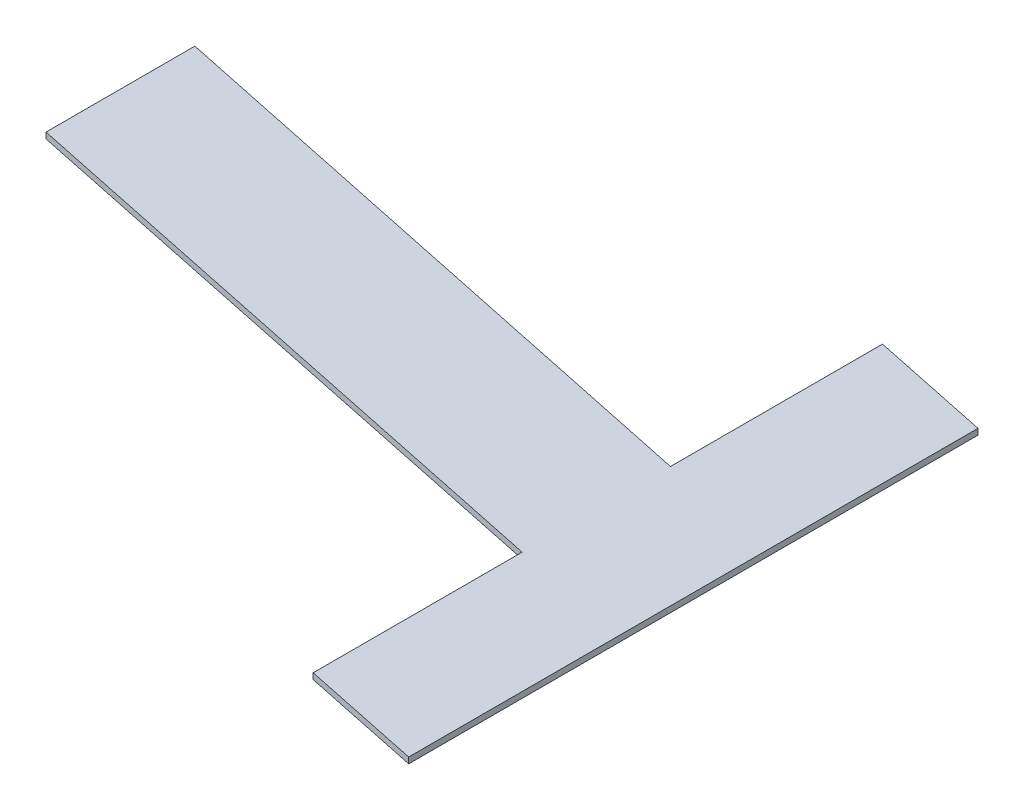
ISO-10303-21;
HEADER;
FILE_DESCRIPTION(('STEP AP214'),'2;1');
FILE_NAME('part.step','',(''),(''),'','','');
FILE_SCHEMA(('AUTOMOTIVE_DESIGN { 1 0 10303 214 1 1 1 1 }'));
ENDSEC;
DATA;
#1=APPLICATION_CONTEXT('core data for automotive mechanical design processes');
#2=APPLICATION_PROTOCOL_DEFINITION('international standard','automotive_design',2000,#1);
#3=PRODUCT_CONTEXT('',#1,'mechanical');
#4=PRODUCT('Part','Part','',(#3));
#5=PRODUCT_RELATED_PRODUCT_CATEGORY('part','',(#4));
#6=PRODUCT_DEFINITION_FORMATION('','',#4);
#7=PRODUCT_DEFINITION_CONTEXT('part definition',#1,'design');
#8=PRODUCT_DEFINITION('design','',#6,#7);
#9=PRODUCT_DEFINITION_SHAPE('','',#8);
#10=(LENGTH_UNIT() NAMED_UNIT(*) SI_UNIT(.MILLI.,.METRE.));
#11=(NAMED_UNIT(*) PLANE_ANGLE_UNIT() SI_UNIT($,.RADIAN.));
#12=(NAMED_UNIT(*) SI_UNIT($,.STERADIAN.) SOLID_ANGLE_UNIT());
#13=UNCERTAINTY_MEASURE_WITH_UNIT(LENGTH_MEASURE(1.E-05),#10,'distance_accuracy_value','');
#14=(GEOMETRIC_REPRESENTATION_CONTEXT(3) GLOBAL_UNCERTAINTY_ASSIGNED_CONTEXT((#13)) GLOBAL_UNIT_ASSIGNED_CONTEXT((#10,
#11,#12)) REPRESENTATION_CONTEXT('',''));
#15=CARTESIAN_POINT('',(0.,0.,0.));
#16=DIRECTION('',(0.,0.,1.));
#17=DIRECTION('',(1.,0.,0.));
#18=AXIS2_PLACEMENT_3D('',#15,#16,#17);
#19=CARTESIAN_POINT('',(-8.631267976045,2.15,0.));
#20=DIRECTION('',(0.,1.,0.));
#21=DIRECTION('',(0.,0.,1.));
#22=AXIS2_PLACEMENT_3D('',#19,#20,#21);
#23=PLANE('',#22);
#24=DIRECTION('',(0.,0.,1.));
#25=VECTOR('',#24,1.);
#26=CARTESIAN_POINT('',(1.178434493358,2.15,0.));
#27=LINE('',#26,#25);
#28=CARTESIAN_POINT('',(1.17843449335784,2.15,0.183907050745779));
#29=VERTEX_POINT('',#28);
#30=CARTESIAN_POINT('',(1.17843449335804,2.15,0.434365657748788));
#31=VERTEX_POINT('',#30);
#32=EDGE_CURVE('E127',#29,#31,#27,.T.);
#33=ORIENTED_EDGE('',*,*,#32,.F.);
#34=DIRECTION('',(-0.978706701973572,0.,-0.20526371211691));
#35=VECTOR('',#34,1.);
#36=CARTESIAN_POINT('',(-8.254899536988,2.15,-1.794541811207));
#37=LINE('',#36,#35);
#38=CARTESIAN_POINT('',(2.1911209793108,2.15,0.396297327523948));
#39=VERTEX_POINT('',#38);
#40=EDGE_CURVE('E122',#39,#29,#37,.T.);
#41=ORIENTED_EDGE('',*,*,#40,.F.);
#42=DIRECTION('',(0.,0.,1.));
#43=VECTOR('',#42,1.);
#44=CARTESIAN_POINT('',(2.191120979311,2.15,0.));
#45=LINE('',#44,#43);
#46=CARTESIAN_POINT('',(2.19112097931101,2.15,0.0395574546863483));
#47=VERTEX_POINT('',#46);
#48=EDGE_CURVE('E116',#47,#39,#45,.T.);
#49=ORIENTED_EDGE('',*,*,#48,.F.);
#50=DIRECTION('',(-0.978918205721413,0.,-0.204252653611086));
#51=VECTOR('',#50,1.);
#52=CARTESIAN_POINT('',(-8.187676525858,2.15,-2.125993169802));
#53=LINE('',#52,#51);
#54=CARTESIAN_POINT('',(2.39420949214301,2.15,0.0819321571092861));
#55=VERTEX_POINT('',#54);
#56=EDGE_CURVE('E110',#55,#47,#53,.T.);
#57=ORIENTED_EDGE('',*,*,#56,.F.);
#58=DIRECTION('',(0.,0.,-1.));
#59=VECTOR('',#58,1.);
#60=CARTESIAN_POINT('',(2.394209492143,2.15,0.));
#61=LINE('',#60,#59);
#62=CARTESIAN_POINT('',(2.39420949214301,2.15,1.03984158871095));
#63=VERTEX_POINT('',#62);
#64=EDGE_CURVE('E104',#63,#55,#61,.T.);
#65=ORIENTED_EDGE('',*,*,#64,.F.);
#66=DIRECTION('',(0.978918205721413,0.,0.204252653611086));
#67=VECTOR('',#66,1.);
#68=CARTESIAN_POINT('',(-8.379207299268,2.15,-1.208046902118));
#69=LINE('',#68,#67);
#70=CARTESIAN_POINT('',(2.19112097931101,2.15,0.997466886287958));
#71=VERTEX_POINT('',#70);
#72=EDGE_CURVE('E80',#71,#63,#69,.T.);
#73=ORIENTED_EDGE('',*,*,#72,.F.);
#74=DIRECTION('',(0.,0.,1.));
#75=VECTOR('',#74,1.);
#76=CARTESIAN_POINT('',(2.191120979311,2.15,0.));
#77=LINE('',#76,#75);
#78=CARTESIAN_POINT('',(2.19112097931105,2.15,0.645894660087744));
#79=VERTEX_POINT('',#78);
#80=EDGE_CURVE('E82',#79,#71,#77,.T.);
#81=ORIENTED_EDGE('',*,*,#80,.F.);
#82=DIRECTION('',(0.978873623936715,0.,0.204466203468941));
#83=VECTOR('',#82,1.);
#84=CARTESIAN_POINT('',(-8.308096150587,2.15,-1.547171955921));
#85=LINE('',#84,#83);
#86=EDGE_CURVE('E20',#31,#79,#85,.T.);
#87=ORIENTED_EDGE('',*,*,#86,.F.);
#88=EDGE_LOOP('',(#33,#41,#49,#57,#65,#73,#81,#87));
#89=FACE_BOUND('',#88,.T.);
#90=ADVANCED_FACE('F17',(#89),#23,.F.);
#91=CARTESIAN_POINT('',(-8.308096150587,2.16,-1.547171955921));
#92=DIRECTION('',(-0.204466203468941,0.,0.978873623936715));
#93=DIRECTION('',(0.978873623936715,0.,0.204466203468941));
#94=AXIS2_PLACEMENT_3D('',#91,#92,#93);
#95=PLANE('',#94);
#96=DIRECTION('',(0.978873623936679,0.,0.204466203469113));
#97=VECTOR('',#96,1.);
#98=CARTESIAN_POINT('',(1.178434493358,2.16,0.434365657749));
#99=LINE('',#98,#97);
#100=CARTESIAN_POINT('',(1.17843449335809,2.16,0.434365657748576));
#101=VERTEX_POINT('',#100);
#102=CARTESIAN_POINT('',(2.19112097931111,2.16,0.645894660087487));
#103=VERTEX_POINT('',#102);
#104=EDGE_CURVE('E131',#101,#103,#99,.T.);
#105=ORIENTED_EDGE('',*,*,#104,.F.);
#106=DIRECTION('',(0.,1.,0.));
#107=VECTOR('',#106,1.);
#108=CARTESIAN_POINT('',(1.178434493358,2.16,0.434365657749));
#109=LINE('',#108,#107);
#110=EDGE_CURVE('E93',#31,#101,#109,.T.);
#111=ORIENTED_EDGE('',*,*,#110,.F.);
#112=ORIENTED_EDGE('',*,*,#86,.T.);
#113=DIRECTION('',(0.,1.,0.));
#114=VECTOR('',#113,1.);
#115=CARTESIAN_POINT('',(2.191120979311,2.16,0.645894660088));
#116=LINE('',#115,#114);
#117=EDGE_CURVE('E88',#103,#79,#116,.F.);
#118=ORIENTED_EDGE('',*,*,#117,.F.);
#119=EDGE_LOOP('',(#105,#111,#112,#118));
#120=FACE_BOUND('',#119,.T.);
#121=ADVANCED_FACE('F90',(#120),#95,.T.);
#122=CARTESIAN_POINT('',(2.191120979311,2.16,0.));
#123=DIRECTION('',(-1.,0.,0.));
#124=DIRECTION('',(0.,0.,1.));
#125=AXIS2_PLACEMENT_3D('',#122,#123,#124);
#126=PLANE('',#125);
#127=DIRECTION('',(0.,0.,1.));
#128=VECTOR('',#127,1.);
#129=CARTESIAN_POINT('',(2.191120979311,2.16,0.));
#130=LINE('',#129,#128);
#131=CARTESIAN_POINT('',(2.19112097931101,2.16,0.997466886287958));
#132=VERTEX_POINT('',#131);
#133=EDGE_CURVE('E97',#103,#132,#130,.T.);
#134=ORIENTED_EDGE('',*,*,#133,.F.);
#135=ORIENTED_EDGE('',*,*,#117,.T.);
#136=ORIENTED_EDGE('',*,*,#80,.T.);
#137=DIRECTION('',(0.,1.,0.));
#138=VECTOR('',#137,1.);
#139=CARTESIAN_POINT('',(2.19112097931104,2.16,0.997466886287832));
#140=LINE('',#139,#138);
#141=EDGE_CURVE('E100',#132,#71,#140,.F.);
#142=ORIENTED_EDGE('',*,*,#141,.F.);
#143=EDGE_LOOP('',(#134,#135,#136,#142));
#144=FACE_BOUND('',#143,.T.);
#145=ADVANCED_FACE('F95',(#144),#126,.T.);
#146=CARTESIAN_POINT('',(-8.379207299268,2.16,-1.208046902118));
#147=DIRECTION('',(-0.204252653611086,0.,0.978918205721413));
#148=DIRECTION('',(0.978918205721413,0.,0.204252653611086));
#149=AXIS2_PLACEMENT_3D('',#146,#147,#148);
#150=PLANE('',#149);
#151=DIRECTION('',(0.978918205721376,0.,0.20425265361126));
#152=VECTOR('',#151,1.);
#153=CARTESIAN_POINT('',(2.191120979311,2.16,0.997466886288));
#154=LINE('',#153,#152);
#155=CARTESIAN_POINT('',(2.39420949214302,2.16,1.0398415887109));
#156=VERTEX_POINT('',#155);
#157=EDGE_CURVE('E134',#132,#156,#154,.T.);
#158=ORIENTED_EDGE('',*,*,#157,.F.);
#159=ORIENTED_EDGE('',*,*,#141,.T.);
#160=ORIENTED_EDGE('',*,*,#72,.T.);
#161=DIRECTION('',(0.,1.,0.));
#162=VECTOR('',#161,1.);
#163=CARTESIAN_POINT('',(2.394209492143,2.16,1.039841588711));
#164=LINE('',#163,#162);
#165=EDGE_CURVE('E107',#156,#63,#164,.F.);
#166=ORIENTED_EDGE('',*,*,#165,.F.);
#167=EDGE_LOOP('',(#158,#159,#160,#166));
#168=FACE_BOUND('',#167,.T.);
#169=ADVANCED_FACE('F161',(#168),#150,.T.);
#170=CARTESIAN_POINT('',(2.394209492143,2.16,0.));
#171=DIRECTION('',(1.,0.,0.));
#172=DIRECTION('',(0.,0.,-1.));
#173=AXIS2_PLACEMENT_3D('',#170,#171,#172);
#174=PLANE('',#173);
#175=DIRECTION('',(0.,0.,1.));
#176=VECTOR('',#175,1.);
#177=CARTESIAN_POINT('',(2.394209492143,2.16,0.));
#178=LINE('',#177,#176);
#179=CARTESIAN_POINT('',(2.39420949214301,2.16,0.0819321571092861));
#180=VERTEX_POINT('',#179);
#181=EDGE_CURVE('E137',#156,#180,#178,.F.);
#182=ORIENTED_EDGE('',*,*,#181,.F.);
#183=ORIENTED_EDGE('',*,*,#165,.T.);
#184=ORIENTED_EDGE('',*,*,#64,.T.);
#185=DIRECTION('',(0.,1.,0.));
#186=VECTOR('',#185,1.);
#187=CARTESIAN_POINT('',(2.39420949214303,2.16,0.0819321571091844));
#188=LINE('',#187,#186);
#189=EDGE_CURVE('E113',#180,#55,#188,.F.);
#190=ORIENTED_EDGE('',*,*,#189,.F.);
#191=EDGE_LOOP('',(#182,#183,#184,#190));
#192=FACE_BOUND('',#191,.T.);
#193=ADVANCED_FACE('F158',(#192),#174,.T.);
#194=CARTESIAN_POINT('',(-8.187676525858,2.16,-2.125993169802));
#195=DIRECTION('',(0.204252653611086,0.,-0.978918205721413));
#196=DIRECTION('',(-0.978918205721413,0.,-0.204252653611086));
#197=AXIS2_PLACEMENT_3D('',#194,#195,#196);
#198=PLANE('',#197);
#199=DIRECTION('',(-0.978918205721444,0.,-0.204252653610937));
#200=VECTOR('',#199,1.);
#201=CARTESIAN_POINT('',(2.394209492143,2.16,0.08193215710932));
#202=LINE('',#201,#200);
#203=CARTESIAN_POINT('',(2.19112097931102,2.16,0.0395574546863069));
#204=VERTEX_POINT('',#203);
#205=EDGE_CURVE('E140',#180,#204,#202,.T.);
#206=ORIENTED_EDGE('',*,*,#205,.F.);
#207=ORIENTED_EDGE('',*,*,#189,.T.);
#208=ORIENTED_EDGE('',*,*,#56,.T.);
#209=DIRECTION('',(0.,1.,0.));
#210=VECTOR('',#209,1.);
#211=CARTESIAN_POINT('',(2.191120979311,2.16,0.03955745468639));
#212=LINE('',#211,#210);
#213=EDGE_CURVE('E119',#204,#47,#212,.F.);
#214=ORIENTED_EDGE('',*,*,#213,.F.);
#215=EDGE_LOOP('',(#206,#207,#208,#214));
#216=FACE_BOUND('',#215,.T.);
#217=ADVANCED_FACE('F155',(#216),#198,.T.);
#218=CARTESIAN_POINT('',(2.191120979311,2.16,0.));
#219=DIRECTION('',(-1.,0.,0.));
#220=DIRECTION('',(0.,0.,1.));
#221=AXIS2_PLACEMENT_3D('',#218,#219,#220);
#222=PLANE('',#221);
#223=DIRECTION('',(0.,0.,1.));
#224=VECTOR('',#223,1.);
#225=CARTESIAN_POINT('',(2.191120979311,2.16,0.));
#226=LINE('',#225,#224);
#227=CARTESIAN_POINT('',(2.1911209793108,2.16,0.396297327523948));
#228=VERTEX_POINT('',#227);
#229=EDGE_CURVE('E143',#204,#228,#226,.T.);
#230=ORIENTED_EDGE('',*,*,#229,.F.);
#231=ORIENTED_EDGE('',*,*,#213,.T.);
#232=ORIENTED_EDGE('',*,*,#48,.T.);
#233=DIRECTION('',(0.,1.,0.));
#234=VECTOR('',#233,1.);
#235=CARTESIAN_POINT('',(2.19112097931021,2.16,0.396297327526794));
#236=LINE('',#235,#234);
#237=EDGE_CURVE('E124',#228,#39,#236,.F.);
#238=ORIENTED_EDGE('',*,*,#237,.F.);
#239=EDGE_LOOP('',(#230,#231,#232,#238));
#240=FACE_BOUND('',#239,.T.);
#241=ADVANCED_FACE('F152',(#240),#222,.T.);
#242=CARTESIAN_POINT('',(-8.254899536988,2.16,-1.794541811207));
#243=DIRECTION('',(0.20526371211691,0.,-0.978706701973572));
#244=DIRECTION('',(-0.978706701973572,0.,-0.20526371211691));
#245=AXIS2_PLACEMENT_3D('',#242,#243,#244);
#246=PLANE('',#245);
#247=DIRECTION('',(-0.978706701973709,0.,-0.205263712116256));
#248=VECTOR('',#247,1.);
#249=CARTESIAN_POINT('',(2.191120979311,2.16,0.396297327523));
#250=LINE('',#249,#248);
#251=CARTESIAN_POINT('',(1.17843449335767,2.16,0.183907050746559));
#252=VERTEX_POINT('',#251);
#253=EDGE_CURVE('E26',#228,#252,#250,.T.);
#254=ORIENTED_EDGE('',*,*,#253,.F.);
#255=ORIENTED_EDGE('',*,*,#237,.T.);
#256=ORIENTED_EDGE('',*,*,#40,.T.);
#257=DIRECTION('',(0.,1.,0.));
#258=VECTOR('',#257,1.);
#259=CARTESIAN_POINT('',(1.178434493358,2.16,0.183907050745));
#260=LINE('',#259,#258);
#261=EDGE_CURVE('E35',#252,#29,#260,.F.);
#262=ORIENTED_EDGE('',*,*,#261,.F.);
#263=EDGE_LOOP('',(#254,#255,#256,#262));
#264=FACE_BOUND('',#263,.T.);
#265=ADVANCED_FACE('F150',(#264),#246,.T.);
#266=CARTESIAN_POINT('',(1.178434493358,2.16,0.));
#267=DIRECTION('',(-1.,0.,0.));
#268=DIRECTION('',(0.,0.,1.));
#269=AXIS2_PLACEMENT_3D('',#266,#267,#268);
#270=PLANE('',#269);
#271=DIRECTION('',(0.,0.,1.));
#272=VECTOR('',#271,1.);
#273=CARTESIAN_POINT('',(1.178434493358,2.16,0.));
#274=LINE('',#273,#272);
#275=EDGE_CURVE('E11',#252,#101,#274,.T.);
#276=ORIENTED_EDGE('',*,*,#275,.F.);
#277=ORIENTED_EDGE('',*,*,#261,.T.);
#278=ORIENTED_EDGE('',*,*,#32,.T.);
#279=ORIENTED_EDGE('',*,*,#110,.T.);
#280=EDGE_LOOP('',(#276,#277,#278,#279));
#281=FACE_BOUND('',#280,.T.);
#282=ADVANCED_FACE('F163',(#281),#270,.T.);
#283=CARTESIAN_POINT('',(-8.631267976045,2.16,0.));
#284=DIRECTION('',(0.,1.,0.));
#285=DIRECTION('',(0.,0.,1.));
#286=AXIS2_PLACEMENT_3D('',#283,#284,#285);
#287=PLANE('',#286);
#288=ORIENTED_EDGE('',*,*,#253,.T.);
#289=ORIENTED_EDGE('',*,*,#275,.T.);
#290=ORIENTED_EDGE('',*,*,#104,.T.);
#291=ORIENTED_EDGE('',*,*,#133,.T.);
#292=ORIENTED_EDGE('',*,*,#157,.T.);
#293=ORIENTED_EDGE('',*,*,#181,.T.);
#294=ORIENTED_EDGE('',*,*,#205,.T.);
#295=ORIENTED_EDGE('',*,*,#229,.T.);
#296=EDGE_LOOP('',(#288,#289,#290,#291,#292,#293,#294,#295));
#297=FACE_BOUND('',#296,.T.);
#298=ADVANCED_FACE('F148',(#297),#287,.T.);
#299=CLOSED_SHELL('',(#90,#121,#145,#169,#193,#217,#241,#265,#282,#298));
#300=MANIFOLD_SOLID_BREP('B1',#299);
#301=ADVANCED_BREP_SHAPE_REPRESENTATION('',(#18,#300),#14);
#302=SHAPE_DEFINITION_REPRESENTATION(#9,#301);
ENDSEC;
END-ISO-10303-21;
